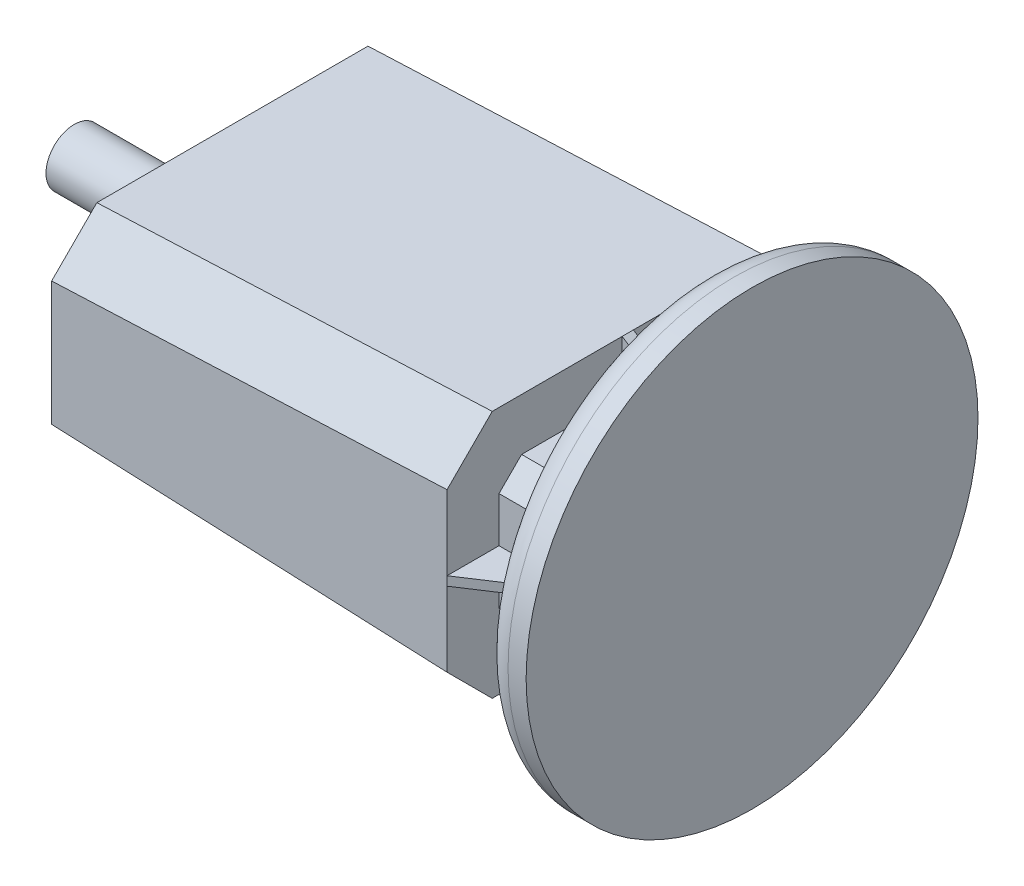
ISO-10303-21;
HEADER;
FILE_DESCRIPTION(('STEP AP214'),'2;1');
FILE_NAME('part.step','',(''),(''),'','','');
FILE_SCHEMA(('AUTOMOTIVE_DESIGN { 1 0 10303 214 1 1 1 1 }'));
ENDSEC;
DATA;
#1=APPLICATION_CONTEXT('core data for automotive mechanical design processes');
#2=APPLICATION_PROTOCOL_DEFINITION('international standard','automotive_design',2000,#1);
#3=PRODUCT_CONTEXT('',#1,'mechanical');
#4=PRODUCT('Part','Part','',(#3));
#5=PRODUCT_RELATED_PRODUCT_CATEGORY('part','',(#4));
#6=PRODUCT_DEFINITION_FORMATION('','',#4);
#7=PRODUCT_DEFINITION_CONTEXT('part definition',#1,'design');
#8=PRODUCT_DEFINITION('design','',#6,#7);
#9=PRODUCT_DEFINITION_SHAPE('','',#8);
#10=(LENGTH_UNIT() NAMED_UNIT(*) SI_UNIT(.MILLI.,.METRE.));
#11=(NAMED_UNIT(*) PLANE_ANGLE_UNIT() SI_UNIT($,.RADIAN.));
#12=(NAMED_UNIT(*) SI_UNIT($,.STERADIAN.) SOLID_ANGLE_UNIT());
#13=UNCERTAINTY_MEASURE_WITH_UNIT(LENGTH_MEASURE(1.E-05),#10,'distance_accuracy_value','');
#14=(GEOMETRIC_REPRESENTATION_CONTEXT(3) GLOBAL_UNCERTAINTY_ASSIGNED_CONTEXT((#13)) GLOBAL_UNIT_ASSIGNED_CONTEXT((#10,
#11,#12)) REPRESENTATION_CONTEXT('',''));
#15=CARTESIAN_POINT('',(0.,0.,0.));
#16=DIRECTION('',(0.,0.,1.));
#17=DIRECTION('',(1.,0.,0.));
#18=AXIS2_PLACEMENT_3D('',#15,#16,#17);
#19=CARTESIAN_POINT('',(175.,55.,160.));
#20=DIRECTION('',(-1.,0.,0.));
#21=DIRECTION('',(0.,0.,1.));
#22=AXIS2_PLACEMENT_3D('',#19,#20,#21);
#23=PLANE('',#22);
#24=DIRECTION('',(0.,0.,1.));
#25=VECTOR('',#24,1.);
#26=CARTESIAN_POINT('',(175.,1.99999999999999,0.));
#27=LINE('',#26,#25);
#28=CARTESIAN_POINT('',(175.,1.99999999999999,0.));
#29=VERTEX_POINT('',#28);
#30=CARTESIAN_POINT('',(175.,1.99999999999999,23.));
#31=VERTEX_POINT('',#30);
#32=EDGE_CURVE('E1006',#29,#31,#27,.T.);
#33=ORIENTED_EDGE('',*,*,#32,.F.);
#34=DIRECTION('',(0.,1.,0.));
#35=VECTOR('',#34,1.);
#36=CARTESIAN_POINT('',(175.,55.,0.));
#37=LINE('',#36,#35);
#38=CARTESIAN_POINT('',(175.,34.9816410793103,0.));
#39=VERTEX_POINT('',#38);
#40=EDGE_CURVE('E323',#29,#39,#37,.T.);
#41=ORIENTED_EDGE('',*,*,#40,.T.);
#42=DIRECTION('',(0.,0.707431100787277,0.706782312766032));
#43=VECTOR('',#42,1.);
#44=CARTESIAN_POINT('',(175.,51.2465592822918,16.2500015784722));
#45=LINE('',#44,#43);
#46=CARTESIAN_POINT('',(175.,55.,20.));
#47=VERTEX_POINT('',#46);
#48=EDGE_CURVE('E347',#39,#47,#45,.T.);
#49=ORIENTED_EDGE('',*,*,#48,.T.);
#50=DIRECTION('',(0.,0.,-1.));
#51=VECTOR('',#50,1.);
#52=CARTESIAN_POINT('',(175.,55.,160.));
#53=LINE('',#52,#51);
#54=CARTESIAN_POINT('',(175.,55.,77.5));
#55=VERTEX_POINT('',#54);
#56=EDGE_CURVE('E320',#55,#47,#53,.T.);
#57=ORIENTED_EDGE('',*,*,#56,.F.);
#58=DIRECTION('',(0.,-1.,0.));
#59=VECTOR('',#58,1.);
#60=CARTESIAN_POINT('',(175.,32.,77.5));
#61=LINE('',#60,#59);
#62=CARTESIAN_POINT('',(175.,32.,77.5));
#63=VERTEX_POINT('',#62);
#64=EDGE_CURVE('E484',#55,#63,#61,.T.);
#65=ORIENTED_EDGE('',*,*,#64,.T.);
#66=DIRECTION('',(0.,0.,1.));
#67=VECTOR('',#66,1.);
#68=CARTESIAN_POINT('',(175.,32.,127.));
#69=LINE('',#68,#67);
#70=CARTESIAN_POINT('',(175.,32.,33.));
#71=VERTEX_POINT('',#70);
#72=EDGE_CURVE('E275',#71,#63,#69,.T.);
#73=ORIENTED_EDGE('',*,*,#72,.F.);
#74=DIRECTION('',(0.,0.707106781186548,0.707106781186548));
#75=VECTOR('',#74,1.);
#76=CARTESIAN_POINT('',(175.,32.,33.));
#77=LINE('',#76,#75);
#78=CARTESIAN_POINT('',(175.,22.,23.));
#79=VERTEX_POINT('',#78);
#80=EDGE_CURVE('E271',#79,#71,#77,.T.);
#81=ORIENTED_EDGE('',*,*,#80,.F.);
#82=DIRECTION('',(0.,1.,0.));
#83=VECTOR('',#82,1.);
#84=CARTESIAN_POINT('',(175.,22.,23.));
#85=LINE('',#84,#83);
#86=EDGE_CURVE('E266',#31,#79,#85,.T.);
#87=ORIENTED_EDGE('',*,*,#86,.F.);
#88=EDGE_LOOP('',(#33,#41,#49,#57,#65,#73,#81,#87));
#89=FACE_BOUND('',#88,.T.);
#90=ADVANCED_FACE('F43',(#89),#23,.F.);
#91=CARTESIAN_POINT('',(210.,22.,23.));
#92=DIRECTION('',(0.,0.,1.));
#93=DIRECTION('',(0.,-1.,0.));
#94=AXIS2_PLACEMENT_3D('',#91,#92,#93);
#95=PLANE('',#94);
#96=DIRECTION('',(1.,0.,0.));
#97=VECTOR('',#96,1.);
#98=CARTESIAN_POINT('',(210.,1.99999999999999,23.));
#99=LINE('',#98,#97);
#100=CARTESIAN_POINT('',(210.,1.99999999999999,23.));
#101=VERTEX_POINT('',#100);
#102=EDGE_CURVE('E1008',#31,#101,#99,.T.);
#103=ORIENTED_EDGE('',*,*,#102,.F.);
#104=ORIENTED_EDGE('',*,*,#86,.T.);
#105=DIRECTION('',(-1.,0.,0.));
#106=VECTOR('',#105,1.);
#107=CARTESIAN_POINT('',(210.,22.,23.));
#108=LINE('',#107,#106);
#109=CARTESIAN_POINT('',(210.,22.,23.));
#110=VERTEX_POINT('',#109);
#111=EDGE_CURVE('E304',#110,#79,#108,.T.);
#112=ORIENTED_EDGE('',*,*,#111,.F.);
#113=DIRECTION('',(0.,1.,0.));
#114=VECTOR('',#113,1.);
#115=CARTESIAN_POINT('',(210.,22.,23.));
#116=LINE('',#115,#114);
#117=EDGE_CURVE('E239',#101,#110,#116,.T.);
#118=ORIENTED_EDGE('',*,*,#117,.F.);
#119=EDGE_LOOP('',(#103,#104,#112,#118));
#120=FACE_BOUND('',#119,.T.);
#121=ADVANCED_FACE('F396',(#120),#95,.F.);
#122=DIRECTION('',(0.,0.,-1.));
#123=VECTOR('',#122,1.);
#124=CARTESIAN_POINT('',(175.,-1.99999999999999,160.));
#125=LINE('',#124,#123);
#126=CARTESIAN_POINT('',(175.,-1.99999999999999,160.));
#127=VERTEX_POINT('',#126);
#128=CARTESIAN_POINT('',(175.,-1.99999999999999,137.));
#129=VERTEX_POINT('',#128);
#130=EDGE_CURVE('E1025',#127,#129,#125,.T.);
#131=ORIENTED_EDGE('',*,*,#130,.F.);
#132=DIRECTION('',(0.,1.,0.));
#133=VECTOR('',#132,1.);
#134=CARTESIAN_POINT('',(175.,55.,160.));
#135=LINE('',#134,#133);
#136=CARTESIAN_POINT('',(175.,-34.9816410793105,160.));
#137=VERTEX_POINT('',#136);
#138=EDGE_CURVE('E317',#137,#127,#135,.T.);
#139=ORIENTED_EDGE('',*,*,#138,.F.);
#140=DIRECTION('',(0.,0.707431100787275,0.706782312766034));
#141=VECTOR('',#140,1.);
#142=CARTESIAN_POINT('',(175.,-31.2029852765055,163.775190381765));
#143=LINE('',#142,#141);
#144=CARTESIAN_POINT('',(175.,-55.,140.));
#145=VERTEX_POINT('',#144);
#146=EDGE_CURVE('E353',#137,#145,#143,.F.);
#147=ORIENTED_EDGE('',*,*,#146,.T.);
#148=DIRECTION('',(0.,0.,-1.));
#149=VECTOR('',#148,1.);
#150=CARTESIAN_POINT('',(175.,-55.,160.));
#151=LINE('',#150,#149);
#152=CARTESIAN_POINT('',(175.,-55.,82.5));
#153=VERTEX_POINT('',#152);
#154=EDGE_CURVE('E330',#145,#153,#151,.T.);
#155=ORIENTED_EDGE('',*,*,#154,.T.);
#156=DIRECTION('',(0.,1.,0.));
#157=VECTOR('',#156,1.);
#158=CARTESIAN_POINT('',(175.,-32.,82.5));
#159=LINE('',#158,#157);
#160=CARTESIAN_POINT('',(175.,-32.,82.5));
#161=VERTEX_POINT('',#160);
#162=EDGE_CURVE('E464',#153,#161,#159,.T.);
#163=ORIENTED_EDGE('',*,*,#162,.T.);
#164=DIRECTION('',(0.,0.,-1.));
#165=VECTOR('',#164,1.);
#166=CARTESIAN_POINT('',(175.,-32.,127.));
#167=LINE('',#166,#165);
#168=CARTESIAN_POINT('',(175.,-32.,127.));
#169=VERTEX_POINT('',#168);
#170=EDGE_CURVE('E240',#169,#161,#167,.T.);
#171=ORIENTED_EDGE('',*,*,#170,.F.);
#172=DIRECTION('',(0.,-0.707106781186546,-0.707106781186549));
#173=VECTOR('',#172,1.);
#174=CARTESIAN_POINT('',(175.,-22.,137.));
#175=LINE('',#174,#173);
#176=CARTESIAN_POINT('',(175.,-22.,137.));
#177=VERTEX_POINT('',#176);
#178=EDGE_CURVE('E285',#177,#169,#175,.T.);
#179=ORIENTED_EDGE('',*,*,#178,.F.);
#180=DIRECTION('',(0.,-1.,0.));
#181=VECTOR('',#180,1.);
#182=CARTESIAN_POINT('',(175.,22.,137.));
#183=LINE('',#182,#181);
#184=EDGE_CURVE('E281',#129,#177,#183,.T.);
#185=ORIENTED_EDGE('',*,*,#184,.F.);
#186=EDGE_LOOP('',(#131,#139,#147,#155,#163,#171,#179,#185));
#187=FACE_BOUND('',#186,.T.);
#188=ADVANCED_FACE('F399',(#187),#23,.F.);
#189=CARTESIAN_POINT('',(210.,22.,137.));
#190=DIRECTION('',(0.,0.,-1.));
#191=DIRECTION('',(-1.,0.,0.));
#192=AXIS2_PLACEMENT_3D('',#189,#190,#191);
#193=PLANE('',#192);
#194=DIRECTION('',(1.,0.,0.));
#195=VECTOR('',#194,1.);
#196=CARTESIAN_POINT('',(210.,-1.99999999999999,137.));
#197=LINE('',#196,#195);
#198=CARTESIAN_POINT('',(210.,-1.99999999999999,137.));
#199=VERTEX_POINT('',#198);
#200=EDGE_CURVE('E515',#129,#199,#197,.T.);
#201=ORIENTED_EDGE('',*,*,#200,.F.);
#202=ORIENTED_EDGE('',*,*,#184,.T.);
#203=DIRECTION('',(-1.,0.,0.));
#204=VECTOR('',#203,1.);
#205=CARTESIAN_POINT('',(210.,-22.,137.));
#206=LINE('',#205,#204);
#207=CARTESIAN_POINT('',(210.,-22.,137.));
#208=VERTEX_POINT('',#207);
#209=EDGE_CURVE('E292',#208,#177,#206,.T.);
#210=ORIENTED_EDGE('',*,*,#209,.F.);
#211=DIRECTION('',(0.,-1.,0.));
#212=VECTOR('',#211,1.);
#213=CARTESIAN_POINT('',(210.,22.,137.));
#214=LINE('',#213,#212);
#215=EDGE_CURVE('E508',#199,#208,#214,.T.);
#216=ORIENTED_EDGE('',*,*,#215,.F.);
#217=EDGE_LOOP('',(#201,#202,#210,#216));
#218=FACE_BOUND('',#217,.T.);
#219=ADVANCED_FACE('F411',(#218),#193,.F.);
#220=CARTESIAN_POINT('',(175.,2.00000000000001,160.));
#221=VERTEX_POINT('',#220);
#222=CARTESIAN_POINT('',(175.,34.9816410793105,160.));
#223=VERTEX_POINT('',#222);
#224=EDGE_CURVE('E315',#221,#223,#135,.T.);
#225=ORIENTED_EDGE('',*,*,#224,.F.);
#226=DIRECTION('',(0.,0.,-1.));
#227=VECTOR('',#226,1.);
#228=CARTESIAN_POINT('',(175.,2.00000000000001,160.));
#229=LINE('',#228,#227);
#230=CARTESIAN_POINT('',(175.,2.00000000000001,137.));
#231=VERTEX_POINT('',#230);
#232=EDGE_CURVE('E439',#221,#231,#229,.T.);
#233=ORIENTED_EDGE('',*,*,#232,.T.);
#234=CARTESIAN_POINT('',(175.,22.,137.));
#235=VERTEX_POINT('',#234);
#236=EDGE_CURVE('E282',#235,#231,#183,.T.);
#237=ORIENTED_EDGE('',*,*,#236,.F.);
#238=DIRECTION('',(0.,-0.707106781186547,0.707106781186548));
#239=VECTOR('',#238,1.);
#240=CARTESIAN_POINT('',(175.,22.,137.));
#241=LINE('',#240,#239);
#242=CARTESIAN_POINT('',(175.,32.,127.));
#243=VERTEX_POINT('',#242);
#244=EDGE_CURVE('E278',#243,#235,#241,.T.);
#245=ORIENTED_EDGE('',*,*,#244,.F.);
#246=CARTESIAN_POINT('',(175.,32.,82.5));
#247=VERTEX_POINT('',#246);
#248=EDGE_CURVE('E274',#247,#243,#69,.T.);
#249=ORIENTED_EDGE('',*,*,#248,.F.);
#250=DIRECTION('',(0.,-1.,0.));
#251=VECTOR('',#250,1.);
#252=CARTESIAN_POINT('',(175.,32.,82.5));
#253=LINE('',#252,#251);
#254=CARTESIAN_POINT('',(175.,55.,82.5));
#255=VERTEX_POINT('',#254);
#256=EDGE_CURVE('E475',#255,#247,#253,.T.);
#257=ORIENTED_EDGE('',*,*,#256,.F.);
#258=CARTESIAN_POINT('',(175.,55.,140.));
#259=VERTEX_POINT('',#258);
#260=EDGE_CURVE('E326',#259,#255,#53,.T.);
#261=ORIENTED_EDGE('',*,*,#260,.F.);
#262=DIRECTION('',(0.,0.707431100787275,-0.706782312766034));
#263=VECTOR('',#262,1.);
#264=CARTESIAN_POINT('',(175.,31.2029852765055,163.775190381765));
#265=LINE('',#264,#263);
#266=EDGE_CURVE('E350',#259,#223,#265,.F.);
#267=ORIENTED_EDGE('',*,*,#266,.T.);
#268=EDGE_LOOP('',(#225,#233,#237,#245,#249,#257,#261,#267));
#269=FACE_BOUND('',#268,.T.);
#270=ADVANCED_FACE('F413',(#269),#23,.F.);
#271=CARTESIAN_POINT('',(210.,-32.,127.));
#272=DIRECTION('',(0.,1.,0.));
#273=DIRECTION('',(0.,0.,1.));
#274=AXIS2_PLACEMENT_3D('',#271,#272,#273);
#275=PLANE('',#274);
#276=DIRECTION('',(1.,0.,0.));
#277=VECTOR('',#276,1.);
#278=CARTESIAN_POINT('',(210.,-32.,82.5));
#279=LINE('',#278,#277);
#280=CARTESIAN_POINT('',(210.,-32.,82.5));
#281=VERTEX_POINT('',#280);
#282=EDGE_CURVE('E467',#161,#281,#279,.T.);
#283=ORIENTED_EDGE('',*,*,#282,.T.);
#284=DIRECTION('',(0.,0.,-1.));
#285=VECTOR('',#284,1.);
#286=CARTESIAN_POINT('',(210.,-32.,127.));
#287=LINE('',#286,#285);
#288=CARTESIAN_POINT('',(210.,-32.,127.));
#289=VERTEX_POINT('',#288);
#290=EDGE_CURVE('E252',#289,#281,#287,.T.);
#291=ORIENTED_EDGE('',*,*,#290,.F.);
#292=DIRECTION('',(-1.,0.,0.));
#293=VECTOR('',#292,1.);
#294=CARTESIAN_POINT('',(210.,-32.,127.));
#295=LINE('',#294,#293);
#296=EDGE_CURVE('E251',#289,#169,#295,.T.);
#297=ORIENTED_EDGE('',*,*,#296,.T.);
#298=ORIENTED_EDGE('',*,*,#170,.T.);
#299=EDGE_LOOP('',(#283,#291,#297,#298));
#300=FACE_BOUND('',#299,.T.);
#301=ADVANCED_FACE('F416',(#300),#275,.F.);
#302=CARTESIAN_POINT('',(175.,-34.9816410793103,0.));
#303=VERTEX_POINT('',#302);
#304=CARTESIAN_POINT('',(175.,-2.00000000000001,0.));
#305=VERTEX_POINT('',#304);
#306=EDGE_CURVE('E316',#303,#305,#37,.T.);
#307=ORIENTED_EDGE('',*,*,#306,.T.);
#308=DIRECTION('',(0.,0.,1.));
#309=VECTOR('',#308,1.);
#310=CARTESIAN_POINT('',(175.,-2.00000000000001,0.));
#311=LINE('',#310,#309);
#312=CARTESIAN_POINT('',(175.,-2.00000000000001,23.));
#313=VERTEX_POINT('',#312);
#314=EDGE_CURVE('E1045',#305,#313,#311,.T.);
#315=ORIENTED_EDGE('',*,*,#314,.T.);
#316=CARTESIAN_POINT('',(175.,-22.,23.));
#317=VERTEX_POINT('',#316);
#318=EDGE_CURVE('E268',#317,#313,#85,.T.);
#319=ORIENTED_EDGE('',*,*,#318,.F.);
#320=DIRECTION('',(0.,0.707106781186547,-0.707106781186548));
#321=VECTOR('',#320,1.);
#322=CARTESIAN_POINT('',(175.,-32.,33.));
#323=LINE('',#322,#321);
#324=CARTESIAN_POINT('',(175.,-32.,33.));
#325=VERTEX_POINT('',#324);
#326=EDGE_CURVE('E264',#325,#317,#323,.T.);
#327=ORIENTED_EDGE('',*,*,#326,.F.);
#328=CARTESIAN_POINT('',(175.,-32.,77.5));
#329=VERTEX_POINT('',#328);
#330=EDGE_CURVE('E249',#329,#325,#167,.T.);
#331=ORIENTED_EDGE('',*,*,#330,.F.);
#332=DIRECTION('',(0.,1.,0.));
#333=VECTOR('',#332,1.);
#334=CARTESIAN_POINT('',(175.,-32.,77.5));
#335=LINE('',#334,#333);
#336=CARTESIAN_POINT('',(175.,-55.,77.5));
#337=VERTEX_POINT('',#336);
#338=EDGE_CURVE('E448',#337,#329,#335,.T.);
#339=ORIENTED_EDGE('',*,*,#338,.F.);
#340=CARTESIAN_POINT('',(175.,-55.,20.));
#341=VERTEX_POINT('',#340);
#342=EDGE_CURVE('E329',#337,#341,#151,.T.);
#343=ORIENTED_EDGE('',*,*,#342,.T.);
#344=DIRECTION('',(0.,0.707431100787277,-0.706782312766032));
#345=VECTOR('',#344,1.);
#346=CARTESIAN_POINT('',(175.,-51.2465592822918,16.2500015784722));
#347=LINE('',#346,#345);
#348=EDGE_CURVE('E355',#341,#303,#347,.T.);
#349=ORIENTED_EDGE('',*,*,#348,.T.);
#350=EDGE_LOOP('',(#307,#315,#319,#327,#331,#339,#343,#349));
#351=FACE_BOUND('',#350,.T.);
#352=ADVANCED_FACE('F400',(#351),#23,.F.);
#353=CARTESIAN_POINT('',(210.,32.,127.));
#354=DIRECTION('',(0.,-1.,0.));
#355=DIRECTION('',(0.,0.,-1.));
#356=AXIS2_PLACEMENT_3D('',#353,#354,#355);
#357=PLANE('',#356);
#358=DIRECTION('',(1.,0.,0.));
#359=VECTOR('',#358,1.);
#360=CARTESIAN_POINT('',(210.,32.,77.5));
#361=LINE('',#360,#359);
#362=CARTESIAN_POINT('',(210.,32.,77.5));
#363=VERTEX_POINT('',#362);
#364=EDGE_CURVE('E487',#63,#363,#361,.T.);
#365=ORIENTED_EDGE('',*,*,#364,.T.);
#366=DIRECTION('',(0.,0.,1.));
#367=VECTOR('',#366,1.);
#368=CARTESIAN_POINT('',(210.,32.,127.));
#369=LINE('',#368,#367);
#370=CARTESIAN_POINT('',(210.,32.,33.));
#371=VERTEX_POINT('',#370);
#372=EDGE_CURVE('E503',#371,#363,#369,.T.);
#373=ORIENTED_EDGE('',*,*,#372,.F.);
#374=DIRECTION('',(-1.,0.,0.));
#375=VECTOR('',#374,1.);
#376=CARTESIAN_POINT('',(210.,32.,33.));
#377=LINE('',#376,#375);
#378=EDGE_CURVE('E301',#371,#71,#377,.T.);
#379=ORIENTED_EDGE('',*,*,#378,.T.);
#380=ORIENTED_EDGE('',*,*,#72,.T.);
#381=EDGE_LOOP('',(#365,#373,#379,#380));
#382=FACE_BOUND('',#381,.T.);
#383=ADVANCED_FACE('F415',(#382),#357,.F.);
#384=CARTESIAN_POINT('',(0.,47.5,160.));
#385=DIRECTION('',(0.0428178383921858,-0.99908289581767,0.));
#386=DIRECTION('',(0.99908289581767,0.0428178383921859,0.));
#387=AXIS2_PLACEMENT_3D('',#384,#385,#386);
#388=PLANE('',#387);
#389=DIRECTION('',(0.,0.,-1.));
#390=VECTOR('',#389,1.);
#391=CARTESIAN_POINT('',(0.,47.5,160.));
#392=LINE('',#391,#390);
#393=CARTESIAN_POINT('',(0.,47.5,140.));
#394=VERTEX_POINT('',#393);
#395=CARTESIAN_POINT('',(0.,47.5,20.));
#396=VERTEX_POINT('',#395);
#397=EDGE_CURVE('E336',#394,#396,#392,.T.);
#398=ORIENTED_EDGE('',*,*,#397,.F.);
#399=DIRECTION('',(0.99908289581767,0.0428178383921859,0.));
#400=VECTOR('',#399,1.);
#401=CARTESIAN_POINT('',(0.,47.5,140.));
#402=LINE('',#401,#400);
#403=EDGE_CURVE('E379',#394,#259,#402,.T.);
#404=ORIENTED_EDGE('',*,*,#403,.T.);
#405=ORIENTED_EDGE('',*,*,#260,.T.);
#406=DIRECTION('',(0.,0.,1.));
#407=VECTOR('',#406,1.);
#408=CARTESIAN_POINT('',(175.,55.,77.5));
#409=LINE('',#408,#407);
#410=EDGE_CURVE('E267',#55,#255,#409,.T.);
#411=ORIENTED_EDGE('',*,*,#410,.F.);
#412=ORIENTED_EDGE('',*,*,#56,.T.);
#413=DIRECTION('',(-0.99908289581767,-0.0428178383921859,0.));
#414=VECTOR('',#413,1.);
#415=CARTESIAN_POINT('',(0.,47.5,20.));
#416=LINE('',#415,#414);
#417=EDGE_CURVE('E376',#47,#396,#416,.T.);
#418=ORIENTED_EDGE('',*,*,#417,.T.);
#419=EDGE_LOOP('',(#398,#404,#405,#411,#412,#418));
#420=FACE_BOUND('',#419,.T.);
#421=ADVANCED_FACE('F422',(#420),#388,.F.);
#422=CARTESIAN_POINT('',(0.,-47.5,160.));
#423=DIRECTION('',(1.,0.,0.));
#424=DIRECTION('',(0.,0.,-1.));
#425=AXIS2_PLACEMENT_3D('',#422,#423,#424);
#426=PLANE('',#425);
#427=CARTESIAN_POINT('',(0.,0.,80.));
#428=DIRECTION('',(1.,0.,0.));
#429=DIRECTION('',(0.,0.,-1.));
#430=AXIS2_PLACEMENT_3D('',#427,#428,#429);
#431=CIRCLE('',#430,12.5);
#432=CARTESIAN_POINT('',(0.,0.,67.5));
#433=VERTEX_POINT('',#432);
#434=EDGE_CURVE('E339',#433,#433,#431,.F.);
#435=ORIENTED_EDGE('',*,*,#434,.F.);
#436=EDGE_LOOP('',(#435));
#437=FACE_BOUND('',#436,.T.);
#438=DIRECTION('',(0.,-1.,0.));
#439=VECTOR('',#438,1.);
#440=CARTESIAN_POINT('',(0.,-47.5,0.));
#441=LINE('',#440,#439);
#442=CARTESIAN_POINT('',(0.,27.4816410793103,0.));
#443=VERTEX_POINT('',#442);
#444=CARTESIAN_POINT('',(0.,-27.4816410793103,0.));
#445=VERTEX_POINT('',#444);
#446=EDGE_CURVE('E311',#443,#445,#441,.T.);
#447=ORIENTED_EDGE('',*,*,#446,.T.);
#448=DIRECTION('',(0.,-0.707431100787277,0.706782312766032));
#449=VECTOR('',#448,1.);
#450=CARTESIAN_POINT('',(0.,-47.5,20.));
#451=LINE('',#450,#449);
#452=CARTESIAN_POINT('',(0.,-47.5,20.));
#453=VERTEX_POINT('',#452);
#454=EDGE_CURVE('E368',#445,#453,#451,.T.);
#455=ORIENTED_EDGE('',*,*,#454,.T.);
#456=DIRECTION('',(0.,0.,-1.));
#457=VECTOR('',#456,1.);
#458=CARTESIAN_POINT('',(0.,-47.5,160.));
#459=LINE('',#458,#457);
#460=CARTESIAN_POINT('',(0.,-47.5,140.));
#461=VERTEX_POINT('',#460);
#462=EDGE_CURVE('E333',#461,#453,#459,.T.);
#463=ORIENTED_EDGE('',*,*,#462,.F.);
#464=DIRECTION('',(0.,-0.707431100787275,-0.706782312766034));
#465=VECTOR('',#464,1.);
#466=CARTESIAN_POINT('',(0.,-27.4564259942137,160.025191960237));
#467=LINE('',#466,#465);
#468=CARTESIAN_POINT('',(0.,-27.4816410793105,160.));
#469=VERTEX_POINT('',#468);
#470=EDGE_CURVE('E366',#461,#469,#467,.F.);
#471=ORIENTED_EDGE('',*,*,#470,.T.);
#472=DIRECTION('',(0.,-1.,0.));
#473=VECTOR('',#472,1.);
#474=CARTESIAN_POINT('',(0.,-47.5,160.));
#475=LINE('',#474,#473);
#476=CARTESIAN_POINT('',(0.,27.4816410793105,160.));
#477=VERTEX_POINT('',#476);
#478=EDGE_CURVE('E312',#477,#469,#475,.T.);
#479=ORIENTED_EDGE('',*,*,#478,.F.);
#480=DIRECTION('',(0.,-0.707431100787275,0.706782312766034));
#481=VECTOR('',#480,1.);
#482=CARTESIAN_POINT('',(0.,27.4564259942137,160.025191960237));
#483=LINE('',#482,#481);
#484=EDGE_CURVE('E364',#477,#394,#483,.F.);
#485=ORIENTED_EDGE('',*,*,#484,.T.);
#486=ORIENTED_EDGE('',*,*,#397,.T.);
#487=DIRECTION('',(0.,-0.707431100787277,-0.706782312766032));
#488=VECTOR('',#487,1.);
#489=CARTESIAN_POINT('',(0.,47.5,20.));
#490=LINE('',#489,#488);
#491=EDGE_CURVE('E362',#396,#443,#490,.T.);
#492=ORIENTED_EDGE('',*,*,#491,.T.);
#493=EDGE_LOOP('',(#447,#455,#463,#471,#479,#485,#486,#492));
#494=FACE_BOUND('',#493,.T.);
#495=ADVANCED_FACE('F538',(#437,#494),#426,.F.);
#496=CARTESIAN_POINT('',(0.,-47.5,160.));
#497=DIRECTION('',(0.0428178383921858,0.99908289581767,0.));
#498=DIRECTION('',(-0.99908289581767,0.0428178383921859,0.));
#499=AXIS2_PLACEMENT_3D('',#496,#497,#498);
#500=PLANE('',#499);
#501=ORIENTED_EDGE('',*,*,#462,.T.);
#502=DIRECTION('',(0.99908289581767,-0.0428178383921859,0.));
#503=VECTOR('',#502,1.);
#504=CARTESIAN_POINT('',(175.,-55.,20.));
#505=LINE('',#504,#503);
#506=EDGE_CURVE('E344',#453,#341,#505,.T.);
#507=ORIENTED_EDGE('',*,*,#506,.T.);
#508=ORIENTED_EDGE('',*,*,#342,.F.);
#509=DIRECTION('',(0.,0.,-1.));
#510=VECTOR('',#509,1.);
#511=CARTESIAN_POINT('',(175.,-55.,82.5));
#512=LINE('',#511,#510);
#513=EDGE_CURVE('E473',#153,#337,#512,.T.);
#514=ORIENTED_EDGE('',*,*,#513,.F.);
#515=ORIENTED_EDGE('',*,*,#154,.F.);
#516=DIRECTION('',(-0.99908289581767,0.0428178383921859,0.));
#517=VECTOR('',#516,1.);
#518=CARTESIAN_POINT('',(0.,-47.5,140.));
#519=LINE('',#518,#517);
#520=EDGE_CURVE('E342',#145,#461,#519,.T.);
#521=ORIENTED_EDGE('',*,*,#520,.T.);
#522=EDGE_LOOP('',(#501,#507,#508,#514,#515,#521));
#523=FACE_BOUND('',#522,.T.);
#524=ADVANCED_FACE('F529',(#523),#500,.F.);
#525=CARTESIAN_POINT('',(0.,0.,160.));
#526=DIRECTION('',(0.,0.,-1.));
#527=DIRECTION('',(-1.,0.,0.));
#528=AXIS2_PLACEMENT_3D('',#525,#526,#527);
#529=PLANE('',#528);
#530=ORIENTED_EDGE('',*,*,#478,.T.);
#531=DIRECTION('',(0.99908289581767,-0.0428178383921859,0.));
#532=VECTOR('',#531,1.);
#533=CARTESIAN_POINT('',(-1.17562530589839,-27.4312571376291,160.));
#534=LINE('',#533,#532);
#535=EDGE_CURVE('E373',#469,#137,#534,.T.);
#536=ORIENTED_EDGE('',*,*,#535,.T.);
#537=ORIENTED_EDGE('',*,*,#138,.T.);
#538=DIRECTION('',(0.,-1.,0.));
#539=VECTOR('',#538,1.);
#540=CARTESIAN_POINT('',(175.,2.00000000000001,160.));
#541=LINE('',#540,#539);
#542=EDGE_CURVE('E444',#221,#127,#541,.T.);
#543=ORIENTED_EDGE('',*,*,#542,.F.);
#544=ORIENTED_EDGE('',*,*,#224,.T.);
#545=DIRECTION('',(-0.99908289581767,-0.0428178383921859,0.));
#546=VECTOR('',#545,1.);
#547=CARTESIAN_POINT('',(-1.17562530589839,27.4312571376291,160.));
#548=LINE('',#547,#546);
#549=EDGE_CURVE('E370',#223,#477,#548,.T.);
#550=ORIENTED_EDGE('',*,*,#549,.T.);
#551=EDGE_LOOP('',(#530,#536,#537,#543,#544,#550));
#552=FACE_BOUND('',#551,.T.);
#553=ADVANCED_FACE('F445',(#552),#529,.F.);
#554=CARTESIAN_POINT('',(0.,0.,0.));
#555=DIRECTION('',(0.,0.,-1.));
#556=DIRECTION('',(-1.,0.,0.));
#557=AXIS2_PLACEMENT_3D('',#554,#555,#556);
#558=PLANE('',#557);
#559=ORIENTED_EDGE('',*,*,#306,.F.);
#560=DIRECTION('',(-0.99908289581767,0.0428178383921859,0.));
#561=VECTOR('',#560,1.);
#562=CARTESIAN_POINT('',(0.856356767843722,-27.5183420836465,0.));
#563=LINE('',#562,#561);
#564=EDGE_CURVE('E360',#303,#445,#563,.T.);
#565=ORIENTED_EDGE('',*,*,#564,.T.);
#566=ORIENTED_EDGE('',*,*,#446,.F.);
#567=DIRECTION('',(0.99908289581767,0.0428178383921859,0.));
#568=VECTOR('',#567,1.);
#569=CARTESIAN_POINT('',(175.856356767844,35.0183420836465,0.));
#570=LINE('',#569,#568);
#571=EDGE_CURVE('E357',#443,#39,#570,.T.);
#572=ORIENTED_EDGE('',*,*,#571,.T.);
#573=ORIENTED_EDGE('',*,*,#40,.F.);
#574=DIRECTION('',(0.,1.,0.));
#575=VECTOR('',#574,1.);
#576=CARTESIAN_POINT('',(175.,-2.00000000000001,0.));
#577=LINE('',#576,#575);
#578=EDGE_CURVE('E1022',#305,#29,#577,.T.);
#579=ORIENTED_EDGE('',*,*,#578,.F.);
#580=EDGE_LOOP('',(#559,#565,#566,#572,#573,#579));
#581=FACE_BOUND('',#580,.T.);
#582=ADVANCED_FACE('F555',(#581),#558,.T.);
#583=CARTESIAN_POINT('',(-70.,0.,80.));
#584=DIRECTION('',(1.,0.,0.));
#585=DIRECTION('',(0.,0.,-1.));
#586=AXIS2_PLACEMENT_3D('',#583,#584,#585);
#587=CYLINDRICAL_SURFACE('',#586,12.5);
#588=CARTESIAN_POINT('',(-70.,0.,80.));
#589=DIRECTION('',(-1.,0.,0.));
#590=DIRECTION('',(0.,0.,1.));
#591=AXIS2_PLACEMENT_3D('',#588,#589,#590);
#592=CIRCLE('',#591,12.5);
#593=CARTESIAN_POINT('',(-70.,0.,92.5));
#594=VERTEX_POINT('',#593);
#595=EDGE_CURVE('E308',#594,#594,#592,.T.);
#596=ORIENTED_EDGE('',*,*,#595,.F.);
#597=EDGE_LOOP('',(#596));
#598=FACE_BOUND('',#597,.T.);
#599=ORIENTED_EDGE('',*,*,#434,.T.);
#600=EDGE_LOOP('',(#599));
#601=FACE_BOUND('',#600,.T.);
#602=ADVANCED_FACE('F610',(#598,#601),#587,.T.);
#603=CARTESIAN_POINT('',(-70.,0.,80.));
#604=DIRECTION('',(-1.,0.,0.));
#605=DIRECTION('',(0.,0.,1.));
#606=AXIS2_PLACEMENT_3D('',#603,#604,#605);
#607=PLANE('',#606);
#608=ORIENTED_EDGE('',*,*,#595,.T.);
#609=EDGE_LOOP('',(#608));
#610=FACE_BOUND('',#609,.T.);
#611=ADVANCED_FACE('F607',(#610),#607,.T.);
#612=CARTESIAN_POINT('',(0.,-47.5,20.));
#613=DIRECTION('',(-0.0302767838828643,-0.706458290600166,-0.707106781186549));
#614=DIRECTION('',(-0.99908289581767,0.0428178383921859,0.));
#615=AXIS2_PLACEMENT_3D('',#612,#613,#614);
#616=PLANE('',#615);
#617=ORIENTED_EDGE('',*,*,#454,.F.);
#618=ORIENTED_EDGE('',*,*,#564,.F.);
#619=ORIENTED_EDGE('',*,*,#348,.F.);
#620=ORIENTED_EDGE('',*,*,#506,.F.);
#621=EDGE_LOOP('',(#617,#618,#619,#620));
#622=FACE_BOUND('',#621,.T.);
#623=ADVANCED_FACE('F561',(#622),#616,.T.);
#624=CARTESIAN_POINT('',(-1.17562530589839,-27.4312571376291,160.));
#625=DIRECTION('',(0.0302767838828643,0.706458290600168,-0.707106781186547));
#626=DIRECTION('',(0.99908289581767,-0.0428178383921859,0.));
#627=AXIS2_PLACEMENT_3D('',#624,#625,#626);
#628=PLANE('',#627);
#629=ORIENTED_EDGE('',*,*,#470,.F.);
#630=ORIENTED_EDGE('',*,*,#520,.F.);
#631=ORIENTED_EDGE('',*,*,#146,.F.);
#632=ORIENTED_EDGE('',*,*,#535,.F.);
#633=EDGE_LOOP('',(#629,#630,#631,#632));
#634=FACE_BOUND('',#633,.T.);
#635=ADVANCED_FACE('F534',(#634),#628,.F.);
#636=CARTESIAN_POINT('',(-1.17562530589839,27.4312571376291,160.));
#637=DIRECTION('',(0.0302767838828643,-0.706458290600168,-0.707106781186547));
#638=DIRECTION('',(-0.99908289581767,-0.0428178383921859,0.));
#639=AXIS2_PLACEMENT_3D('',#636,#637,#638);
#640=PLANE('',#639);
#641=ORIENTED_EDGE('',*,*,#266,.F.);
#642=ORIENTED_EDGE('',*,*,#403,.F.);
#643=ORIENTED_EDGE('',*,*,#484,.F.);
#644=ORIENTED_EDGE('',*,*,#549,.F.);
#645=EDGE_LOOP('',(#641,#642,#643,#644));
#646=FACE_BOUND('',#645,.T.);
#647=ADVANCED_FACE('F540',(#646),#640,.F.);
#648=CARTESIAN_POINT('',(0.,47.5,20.));
#649=DIRECTION('',(-0.0302767838828643,0.706458290600166,-0.707106781186549));
#650=DIRECTION('',(0.99908289581767,0.0428178383921859,0.));
#651=AXIS2_PLACEMENT_3D('',#648,#649,#650);
#652=PLANE('',#651);
#653=ORIENTED_EDGE('',*,*,#48,.F.);
#654=ORIENTED_EDGE('',*,*,#571,.F.);
#655=ORIENTED_EDGE('',*,*,#491,.F.);
#656=ORIENTED_EDGE('',*,*,#417,.F.);
#657=EDGE_LOOP('',(#653,#654,#655,#656));
#658=FACE_BOUND('',#657,.T.);
#659=ADVANCED_FACE('F549',(#658),#652,.T.);
#660=CARTESIAN_POINT('',(210.,-32.,33.));
#661=DIRECTION('',(0.,0.707106781186548,0.707106781186547));
#662=DIRECTION('',(0.,-0.707106781186547,0.707106781186548));
#663=AXIS2_PLACEMENT_3D('',#660,#661,#662);
#664=PLANE('',#663);
#665=ORIENTED_EDGE('',*,*,#326,.T.);
#666=DIRECTION('',(-1.,0.,0.));
#667=VECTOR('',#666,1.);
#668=CARTESIAN_POINT('',(210.,-22.,23.));
#669=LINE('',#668,#667);
#670=CARTESIAN_POINT('',(210.,-22.,23.));
#671=VERTEX_POINT('',#670);
#672=EDGE_CURVE('E235',#671,#317,#669,.T.);
#673=ORIENTED_EDGE('',*,*,#672,.F.);
#674=DIRECTION('',(0.,0.707106781186547,-0.707106781186548));
#675=VECTOR('',#674,1.);
#676=CARTESIAN_POINT('',(210.,-32.,33.));
#677=LINE('',#676,#675);
#678=CARTESIAN_POINT('',(210.,-32.,33.));
#679=VERTEX_POINT('',#678);
#680=EDGE_CURVE('E229',#679,#671,#677,.T.);
#681=ORIENTED_EDGE('',*,*,#680,.F.);
#682=DIRECTION('',(-1.,0.,0.));
#683=VECTOR('',#682,1.);
#684=CARTESIAN_POINT('',(210.,-32.,33.));
#685=LINE('',#684,#683);
#686=EDGE_CURVE('E233',#679,#325,#685,.T.);
#687=ORIENTED_EDGE('',*,*,#686,.T.);
#688=EDGE_LOOP('',(#665,#673,#681,#687));
#689=FACE_BOUND('',#688,.T.);
#690=ADVANCED_FACE('F232',(#689),#664,.F.);
#691=ORIENTED_EDGE('',*,*,#318,.T.);
#692=DIRECTION('',(1.,0.,0.));
#693=VECTOR('',#692,1.);
#694=CARTESIAN_POINT('',(210.,-2.00000000000001,23.));
#695=LINE('',#694,#693);
#696=CARTESIAN_POINT('',(210.,-2.00000000000001,23.));
#697=VERTEX_POINT('',#696);
#698=EDGE_CURVE('E1027',#313,#697,#695,.T.);
#699=ORIENTED_EDGE('',*,*,#698,.T.);
#700=EDGE_CURVE('E497',#671,#697,#116,.T.);
#701=ORIENTED_EDGE('',*,*,#700,.F.);
#702=ORIENTED_EDGE('',*,*,#672,.T.);
#703=EDGE_LOOP('',(#691,#699,#701,#702));
#704=FACE_BOUND('',#703,.T.);
#705=ADVANCED_FACE('F406',(#704),#95,.F.);
#706=CARTESIAN_POINT('',(210.,32.,33.));
#707=DIRECTION('',(0.,-0.707106781186548,0.707106781186548));
#708=DIRECTION('',(0.,-0.707106781186548,-0.707106781186548));
#709=AXIS2_PLACEMENT_3D('',#706,#707,#708);
#710=PLANE('',#709);
#711=ORIENTED_EDGE('',*,*,#80,.T.);
#712=ORIENTED_EDGE('',*,*,#378,.F.);
#713=DIRECTION('',(0.,0.707106781186548,0.707106781186548));
#714=VECTOR('',#713,1.);
#715=CARTESIAN_POINT('',(210.,32.,33.));
#716=LINE('',#715,#714);
#717=EDGE_CURVE('E499',#110,#371,#716,.T.);
#718=ORIENTED_EDGE('',*,*,#717,.F.);
#719=ORIENTED_EDGE('',*,*,#111,.T.);
#720=EDGE_LOOP('',(#711,#712,#718,#719));
#721=FACE_BOUND('',#720,.T.);
#722=ADVANCED_FACE('F598',(#721),#710,.F.);
#723=CARTESIAN_POINT('',(210.,32.,82.5));
#724=VERTEX_POINT('',#723);
#725=CARTESIAN_POINT('',(210.,32.,127.));
#726=VERTEX_POINT('',#725);
#727=EDGE_CURVE('E502',#724,#726,#369,.T.);
#728=ORIENTED_EDGE('',*,*,#727,.F.);
#729=DIRECTION('',(1.,0.,0.));
#730=VECTOR('',#729,1.);
#731=CARTESIAN_POINT('',(210.,32.,82.5));
#732=LINE('',#731,#730);
#733=EDGE_CURVE('E478',#247,#724,#732,.T.);
#734=ORIENTED_EDGE('',*,*,#733,.F.);
#735=ORIENTED_EDGE('',*,*,#248,.T.);
#736=DIRECTION('',(-1.,0.,0.));
#737=VECTOR('',#736,1.);
#738=CARTESIAN_POINT('',(210.,32.,127.));
#739=LINE('',#738,#737);
#740=EDGE_CURVE('E298',#726,#243,#739,.T.);
#741=ORIENTED_EDGE('',*,*,#740,.F.);
#742=EDGE_LOOP('',(#728,#734,#735,#741));
#743=FACE_BOUND('',#742,.T.);
#744=ADVANCED_FACE('F425',(#743),#357,.F.);
#745=CARTESIAN_POINT('',(210.,22.,137.));
#746=DIRECTION('',(0.,-0.707106781186548,-0.707106781186547));
#747=DIRECTION('',(0.,0.707106781186547,-0.707106781186548));
#748=AXIS2_PLACEMENT_3D('',#745,#746,#747);
#749=PLANE('',#748);
#750=ORIENTED_EDGE('',*,*,#244,.T.);
#751=DIRECTION('',(-1.,0.,0.));
#752=VECTOR('',#751,1.);
#753=CARTESIAN_POINT('',(210.,22.,137.));
#754=LINE('',#753,#752);
#755=CARTESIAN_POINT('',(210.,22.,137.));
#756=VERTEX_POINT('',#755);
#757=EDGE_CURVE('E295',#756,#235,#754,.T.);
#758=ORIENTED_EDGE('',*,*,#757,.F.);
#759=DIRECTION('',(0.,-0.707106781186547,0.707106781186548));
#760=VECTOR('',#759,1.);
#761=CARTESIAN_POINT('',(210.,22.,137.));
#762=LINE('',#761,#760);
#763=EDGE_CURVE('E506',#726,#756,#762,.T.);
#764=ORIENTED_EDGE('',*,*,#763,.F.);
#765=ORIENTED_EDGE('',*,*,#740,.T.);
#766=EDGE_LOOP('',(#750,#758,#764,#765));
#767=FACE_BOUND('',#766,.T.);
#768=ADVANCED_FACE('F592',(#767),#749,.F.);
#769=ORIENTED_EDGE('',*,*,#236,.T.);
#770=DIRECTION('',(1.,0.,0.));
#771=VECTOR('',#770,1.);
#772=CARTESIAN_POINT('',(210.,2.00000000000001,137.));
#773=LINE('',#772,#771);
#774=CARTESIAN_POINT('',(210.,2.00000000000001,137.));
#775=VERTEX_POINT('',#774);
#776=EDGE_CURVE('E1033',#231,#775,#773,.T.);
#777=ORIENTED_EDGE('',*,*,#776,.T.);
#778=EDGE_CURVE('E260',#756,#775,#214,.T.);
#779=ORIENTED_EDGE('',*,*,#778,.F.);
#780=ORIENTED_EDGE('',*,*,#757,.T.);
#781=EDGE_LOOP('',(#769,#777,#779,#780));
#782=FACE_BOUND('',#781,.T.);
#783=ADVANCED_FACE('F435',(#782),#193,.F.);
#784=CARTESIAN_POINT('',(210.,-22.,137.));
#785=DIRECTION('',(0.,0.707106781186549,-0.707106781186546));
#786=DIRECTION('',(0.,0.707106781186546,0.707106781186549));
#787=AXIS2_PLACEMENT_3D('',#784,#785,#786);
#788=PLANE('',#787);
#789=ORIENTED_EDGE('',*,*,#178,.T.);
#790=ORIENTED_EDGE('',*,*,#296,.F.);
#791=DIRECTION('',(0.,-0.707106781186546,-0.707106781186549));
#792=VECTOR('',#791,1.);
#793=CARTESIAN_POINT('',(210.,-22.,137.));
#794=LINE('',#793,#792);
#795=EDGE_CURVE('E257',#208,#289,#794,.T.);
#796=ORIENTED_EDGE('',*,*,#795,.F.);
#797=ORIENTED_EDGE('',*,*,#209,.T.);
#798=EDGE_LOOP('',(#789,#790,#796,#797));
#799=FACE_BOUND('',#798,.T.);
#800=ADVANCED_FACE('F519',(#799),#788,.F.);
#801=CARTESIAN_POINT('',(210.,-32.,77.5));
#802=VERTEX_POINT('',#801);
#803=EDGE_CURVE('E246',#802,#679,#287,.T.);
#804=ORIENTED_EDGE('',*,*,#803,.F.);
#805=DIRECTION('',(1.,0.,0.));
#806=VECTOR('',#805,1.);
#807=CARTESIAN_POINT('',(210.,-32.,77.5));
#808=LINE('',#807,#806);
#809=EDGE_CURVE('E451',#329,#802,#808,.T.);
#810=ORIENTED_EDGE('',*,*,#809,.F.);
#811=ORIENTED_EDGE('',*,*,#330,.T.);
#812=ORIENTED_EDGE('',*,*,#686,.F.);
#813=EDGE_LOOP('',(#804,#810,#811,#812));
#814=FACE_BOUND('',#813,.T.);
#815=ADVANCED_FACE('F244',(#814),#275,.F.);
#816=CARTESIAN_POINT('',(175.,55.,77.5));
#817=DIRECTION('',(0.549177886660837,0.835705479701274,0.));
#818=DIRECTION('',(-0.835705479701274,0.549177886660837,0.));
#819=AXIS2_PLACEMENT_3D('',#816,#817,#818);
#820=PLANE('',#819);
#821=ORIENTED_EDGE('',*,*,#410,.T.);
#822=DIRECTION('',(-0.835705479701274,0.549177886660837,0.));
#823=VECTOR('',#822,1.);
#824=CARTESIAN_POINT('',(175.,55.,82.5));
#825=LINE('',#824,#823);
#826=EDGE_CURVE('E481',#724,#255,#825,.T.);
#827=ORIENTED_EDGE('',*,*,#826,.F.);
#828=DIRECTION('',(0.,0.,1.));
#829=VECTOR('',#828,1.);
#830=CARTESIAN_POINT('',(210.,32.,77.5));
#831=LINE('',#830,#829);
#832=EDGE_CURVE('E493',#363,#724,#831,.T.);
#833=ORIENTED_EDGE('',*,*,#832,.F.);
#834=DIRECTION('',(-0.835705479701274,0.549177886660837,0.));
#835=VECTOR('',#834,1.);
#836=CARTESIAN_POINT('',(175.,55.,77.5));
#837=LINE('',#836,#835);
#838=EDGE_CURVE('E490',#363,#55,#837,.T.);
#839=ORIENTED_EDGE('',*,*,#838,.T.);
#840=EDGE_LOOP('',(#821,#827,#833,#839));
#841=FACE_BOUND('',#840,.T.);
#842=ADVANCED_FACE('F583',(#841),#820,.T.);
#843=CARTESIAN_POINT('',(0.,0.,77.5));
#844=DIRECTION('',(0.,0.,1.));
#845=DIRECTION('',(1.,0.,0.));
#846=AXIS2_PLACEMENT_3D('',#843,#844,#845);
#847=PLANE('',#846);
#848=ORIENTED_EDGE('',*,*,#64,.F.);
#849=ORIENTED_EDGE('',*,*,#838,.F.);
#850=ORIENTED_EDGE('',*,*,#364,.F.);
#851=EDGE_LOOP('',(#848,#849,#850));
#852=FACE_BOUND('',#851,.T.);
#853=ADVANCED_FACE('F576',(#852),#847,.F.);
#854=CARTESIAN_POINT('',(0.,0.,82.5));
#855=DIRECTION('',(0.,0.,1.));
#856=DIRECTION('',(1.,0.,0.));
#857=AXIS2_PLACEMENT_3D('',#854,#855,#856);
#858=PLANE('',#857);
#859=ORIENTED_EDGE('',*,*,#256,.T.);
#860=ORIENTED_EDGE('',*,*,#733,.T.);
#861=ORIENTED_EDGE('',*,*,#826,.T.);
#862=EDGE_LOOP('',(#859,#860,#861));
#863=FACE_BOUND('',#862,.T.);
#864=ADVANCED_FACE('F569',(#863),#858,.T.);
#865=CARTESIAN_POINT('',(175.,-55.,82.5));
#866=DIRECTION('',(0.549177886660837,-0.835705479701274,0.));
#867=DIRECTION('',(0.835705479701274,0.549177886660837,0.));
#868=AXIS2_PLACEMENT_3D('',#865,#866,#867);
#869=PLANE('',#868);
#870=ORIENTED_EDGE('',*,*,#513,.T.);
#871=DIRECTION('',(-0.835705479701274,-0.549177886660837,0.));
#872=VECTOR('',#871,1.);
#873=CARTESIAN_POINT('',(175.,-55.,77.5));
#874=LINE('',#873,#872);
#875=EDGE_CURVE('E461',#802,#337,#874,.T.);
#876=ORIENTED_EDGE('',*,*,#875,.F.);
#877=DIRECTION('',(0.,0.,-1.));
#878=VECTOR('',#877,1.);
#879=CARTESIAN_POINT('',(210.,-32.,82.5));
#880=LINE('',#879,#878);
#881=EDGE_CURVE('E256',#281,#802,#880,.T.);
#882=ORIENTED_EDGE('',*,*,#881,.F.);
#883=DIRECTION('',(-0.835705479701274,-0.549177886660837,0.));
#884=VECTOR('',#883,1.);
#885=CARTESIAN_POINT('',(175.,-55.,82.5));
#886=LINE('',#885,#884);
#887=EDGE_CURVE('E470',#281,#153,#886,.T.);
#888=ORIENTED_EDGE('',*,*,#887,.T.);
#889=EDGE_LOOP('',(#870,#876,#882,#888));
#890=FACE_BOUND('',#889,.T.);
#891=ADVANCED_FACE('F567',(#890),#869,.T.);
#892=CARTESIAN_POINT('',(0.,0.,82.5));
#893=DIRECTION('',(0.,0.,-1.));
#894=DIRECTION('',(1.,0.,0.));
#895=AXIS2_PLACEMENT_3D('',#892,#893,#894);
#896=PLANE('',#895);
#897=ORIENTED_EDGE('',*,*,#162,.F.);
#898=ORIENTED_EDGE('',*,*,#887,.F.);
#899=ORIENTED_EDGE('',*,*,#282,.F.);
#900=EDGE_LOOP('',(#897,#898,#899));
#901=FACE_BOUND('',#900,.T.);
#902=ADVANCED_FACE('F523',(#901),#896,.F.);
#903=CARTESIAN_POINT('',(0.,0.,77.5));
#904=DIRECTION('',(0.,0.,-1.));
#905=DIRECTION('',(1.,0.,0.));
#906=AXIS2_PLACEMENT_3D('',#903,#904,#905);
#907=PLANE('',#906);
#908=ORIENTED_EDGE('',*,*,#338,.T.);
#909=ORIENTED_EDGE('',*,*,#809,.T.);
#910=ORIENTED_EDGE('',*,*,#875,.T.);
#911=EDGE_LOOP('',(#908,#909,#910));
#912=FACE_BOUND('',#911,.T.);
#913=ADVANCED_FACE('F565',(#912),#907,.T.);
#914=CARTESIAN_POINT('',(175.,2.00000000000001,160.));
#915=DIRECTION('',(0.549177886660837,0.,0.835705479701274));
#916=DIRECTION('',(0.835705479701274,0.,-0.549177886660837));
#917=AXIS2_PLACEMENT_3D('',#914,#915,#916);
#918=PLANE('',#917);
#919=ORIENTED_EDGE('',*,*,#542,.T.);
#920=DIRECTION('',(-0.835705479701274,0.,0.549177886660837));
#921=VECTOR('',#920,1.);
#922=CARTESIAN_POINT('',(175.,-1.99999999999999,160.));
#923=LINE('',#922,#921);
#924=EDGE_CURVE('E66',#199,#127,#923,.T.);
#925=ORIENTED_EDGE('',*,*,#924,.F.);
#926=DIRECTION('',(0.,-1.,0.));
#927=VECTOR('',#926,1.);
#928=CARTESIAN_POINT('',(210.,2.00000000000001,137.));
#929=LINE('',#928,#927);
#930=EDGE_CURVE('E449',#775,#199,#929,.T.);
#931=ORIENTED_EDGE('',*,*,#930,.F.);
#932=DIRECTION('',(-0.835705479701274,0.,0.549177886660837));
#933=VECTOR('',#932,1.);
#934=CARTESIAN_POINT('',(175.,2.00000000000001,160.));
#935=LINE('',#934,#933);
#936=EDGE_CURVE('E454',#775,#221,#935,.T.);
#937=ORIENTED_EDGE('',*,*,#936,.T.);
#938=EDGE_LOOP('',(#919,#925,#931,#937));
#939=FACE_BOUND('',#938,.T.);
#940=ADVANCED_FACE('F725',(#939),#918,.T.);
#941=CARTESIAN_POINT('',(0.,2.00000000000001,0.));
#942=DIRECTION('',(0.,1.,0.));
#943=DIRECTION('',(0.,0.,1.));
#944=AXIS2_PLACEMENT_3D('',#941,#942,#943);
#945=PLANE('',#944);
#946=ORIENTED_EDGE('',*,*,#232,.F.);
#947=ORIENTED_EDGE('',*,*,#936,.F.);
#948=ORIENTED_EDGE('',*,*,#776,.F.);
#949=EDGE_LOOP('',(#946,#947,#948));
#950=FACE_BOUND('',#949,.T.);
#951=ADVANCED_FACE('F736',(#950),#945,.T.);
#952=CARTESIAN_POINT('',(0.,-1.99999999999999,0.));
#953=DIRECTION('',(0.,1.,0.));
#954=DIRECTION('',(0.,0.,1.));
#955=AXIS2_PLACEMENT_3D('',#952,#953,#954);
#956=PLANE('',#955);
#957=ORIENTED_EDGE('',*,*,#130,.T.);
#958=ORIENTED_EDGE('',*,*,#200,.T.);
#959=ORIENTED_EDGE('',*,*,#924,.T.);
#960=EDGE_LOOP('',(#957,#958,#959));
#961=FACE_BOUND('',#960,.T.);
#962=ADVANCED_FACE('F747',(#961),#956,.F.);
#963=CARTESIAN_POINT('',(175.,-2.00000000000001,0.));
#964=DIRECTION('',(0.549177886660837,0.,-0.835705479701274));
#965=DIRECTION('',(-0.835705479701274,0.,-0.549177886660837));
#966=AXIS2_PLACEMENT_3D('',#963,#964,#965);
#967=PLANE('',#966);
#968=ORIENTED_EDGE('',*,*,#578,.T.);
#969=DIRECTION('',(-0.835705479701274,0.,-0.549177886660837));
#970=VECTOR('',#969,1.);
#971=CARTESIAN_POINT('',(175.,1.99999999999999,0.));
#972=LINE('',#971,#970);
#973=EDGE_CURVE('E58',#101,#29,#972,.T.);
#974=ORIENTED_EDGE('',*,*,#973,.F.);
#975=DIRECTION('',(0.,1.,0.));
#976=VECTOR('',#975,1.);
#977=CARTESIAN_POINT('',(210.,-2.00000000000001,23.));
#978=LINE('',#977,#976);
#979=EDGE_CURVE('E1019',#697,#101,#978,.T.);
#980=ORIENTED_EDGE('',*,*,#979,.F.);
#981=DIRECTION('',(-0.835705479701274,0.,-0.549177886660837));
#982=VECTOR('',#981,1.);
#983=CARTESIAN_POINT('',(175.,-2.00000000000001,0.));
#984=LINE('',#983,#982);
#985=EDGE_CURVE('E1023',#697,#305,#984,.T.);
#986=ORIENTED_EDGE('',*,*,#985,.T.);
#987=EDGE_LOOP('',(#968,#974,#980,#986));
#988=FACE_BOUND('',#987,.T.);
#989=ADVANCED_FACE('F758',(#988),#967,.T.);
#990=CARTESIAN_POINT('',(0.,-2.00000000000001,160.));
#991=DIRECTION('',(0.,-1.,0.));
#992=DIRECTION('',(0.,0.,-1.));
#993=AXIS2_PLACEMENT_3D('',#990,#991,#992);
#994=PLANE('',#993);
#995=ORIENTED_EDGE('',*,*,#314,.F.);
#996=ORIENTED_EDGE('',*,*,#985,.F.);
#997=ORIENTED_EDGE('',*,*,#698,.F.);
#998=EDGE_LOOP('',(#995,#996,#997));
#999=FACE_BOUND('',#998,.T.);
#1000=ADVANCED_FACE('F769',(#999),#994,.T.);
#1001=CARTESIAN_POINT('',(0.,1.99999999999999,160.));
#1002=DIRECTION('',(0.,-1.,0.));
#1003=DIRECTION('',(0.,0.,-1.));
#1004=AXIS2_PLACEMENT_3D('',#1001,#1002,#1003);
#1005=PLANE('',#1004);
#1006=ORIENTED_EDGE('',*,*,#32,.T.);
#1007=ORIENTED_EDGE('',*,*,#102,.T.);
#1008=ORIENTED_EDGE('',*,*,#973,.T.);
#1009=EDGE_LOOP('',(#1006,#1007,#1008));
#1010=FACE_BOUND('',#1009,.T.);
#1011=ADVANCED_FACE('F780',(#1010),#1005,.F.);
#1012=CARTESIAN_POINT('',(210.,0.,80.));
#1013=DIRECTION('',(1.,0.,0.));
#1014=DIRECTION('',(0.,0.,-1.));
#1015=AXIS2_PLACEMENT_3D('',#1012,#1013,#1014);
#1016=PLANE('',#1015);
#1017=CARTESIAN_POINT('',(210.,0.,80.));
#1018=DIRECTION('',(1.,0.,0.));
#1019=DIRECTION('',(0.,0.,-1.));
#1020=AXIS2_PLACEMENT_3D('',#1017,#1018,#1019);
#1021=CIRCLE('',#1020,88.);
#1022=CARTESIAN_POINT('',(210.,0.,-7.99999999999999));
#1023=VERTEX_POINT('',#1022);
#1024=EDGE_CURVE('E11',#1023,#1023,#1021,.F.);
#1025=ORIENTED_EDGE('',*,*,#1024,.T.);
#1026=EDGE_LOOP('',(#1025));
#1027=FACE_BOUND('',#1026,.T.);
#1028=ORIENTED_EDGE('',*,*,#803,.T.);
#1029=ORIENTED_EDGE('',*,*,#680,.T.);
#1030=ORIENTED_EDGE('',*,*,#700,.T.);
#1031=ORIENTED_EDGE('',*,*,#979,.T.);
#1032=ORIENTED_EDGE('',*,*,#117,.T.);
#1033=ORIENTED_EDGE('',*,*,#717,.T.);
#1034=ORIENTED_EDGE('',*,*,#372,.T.);
#1035=ORIENTED_EDGE('',*,*,#832,.T.);
#1036=ORIENTED_EDGE('',*,*,#727,.T.);
#1037=ORIENTED_EDGE('',*,*,#763,.T.);
#1038=ORIENTED_EDGE('',*,*,#778,.T.);
#1039=ORIENTED_EDGE('',*,*,#930,.T.);
#1040=ORIENTED_EDGE('',*,*,#215,.T.);
#1041=ORIENTED_EDGE('',*,*,#795,.T.);
#1042=ORIENTED_EDGE('',*,*,#290,.T.);
#1043=ORIENTED_EDGE('',*,*,#881,.T.);
#1044=EDGE_LOOP('',(#1028,#1029,#1030,#1031,#1032,#1033,#1034,#1035,#1036,#1037,#1038,#1039,
#1040,#1041,#1042,#1043));
#1045=FACE_BOUND('',#1044,.T.);
#1046=ADVANCED_FACE('F254',(#1027,#1045),#1016,.F.);
#1047=CARTESIAN_POINT('',(230.,0.,80.));
#1048=DIRECTION('',(-1.,0.,0.));
#1049=DIRECTION('',(0.,0.,1.));
#1050=AXIS2_PLACEMENT_3D('',#1047,#1048,#1049);
#1051=CYLINDRICAL_SURFACE('',#1050,100.);
#1052=CARTESIAN_POINT('',(222.,0.,80.));
#1053=DIRECTION('',(1.,0.,0.));
#1054=DIRECTION('',(0.,0.,-1.));
#1055=AXIS2_PLACEMENT_3D('',#1052,#1053,#1054);
#1056=CIRCLE('',#1055,100.);
#1057=CARTESIAN_POINT('',(222.,0.,-20.));
#1058=VERTEX_POINT('',#1057);
#1059=EDGE_CURVE('E51',#1058,#1058,#1056,.T.);
#1060=ORIENTED_EDGE('',*,*,#1059,.T.);
#1061=EDGE_LOOP('',(#1060));
#1062=FACE_BOUND('',#1061,.T.);
#1063=CARTESIAN_POINT('',(230.,0.,80.));
#1064=DIRECTION('',(1.,0.,0.));
#1065=DIRECTION('',(0.,0.,-1.));
#1066=AXIS2_PLACEMENT_3D('',#1063,#1064,#1065);
#1067=CIRCLE('',#1066,100.);
#1068=CARTESIAN_POINT('',(230.,0.,-20.));
#1069=VERTEX_POINT('',#1068);
#1070=EDGE_CURVE('E1011',#1069,#1069,#1067,.T.);
#1071=ORIENTED_EDGE('',*,*,#1070,.F.);
#1072=EDGE_LOOP('',(#1071));
#1073=FACE_BOUND('',#1072,.T.);
#1074=ADVANCED_FACE('F383',(#1062,#1073),#1051,.T.);
#1075=CARTESIAN_POINT('',(230.,0.,80.));
#1076=DIRECTION('',(1.,0.,0.));
#1077=DIRECTION('',(0.,0.,-1.));
#1078=AXIS2_PLACEMENT_3D('',#1075,#1076,#1077);
#1079=PLANE('',#1078);
#1080=ORIENTED_EDGE('',*,*,#1070,.T.);
#1081=EDGE_LOOP('',(#1080));
#1082=FACE_BOUND('',#1081,.T.);
#1083=ADVANCED_FACE('F387',(#1082),#1079,.T.);
#1084=CARTESIAN_POINT('',(222.,0.,80.));
#1085=DIRECTION('',(1.,0.,0.));
#1086=DIRECTION('',(0.,0.,-1.));
#1087=AXIS2_PLACEMENT_3D('',#1084,#1085,#1086);
#1088=TOROIDAL_SURFACE('',#1087,88.,12.);
#1089=ORIENTED_EDGE('',*,*,#1024,.F.);
#1090=EDGE_LOOP('',(#1089));
#1091=FACE_BOUND('',#1090,.T.);
#1092=ORIENTED_EDGE('',*,*,#1059,.F.);
#1093=EDGE_LOOP('',(#1092));
#1094=FACE_BOUND('',#1093,.T.);
#1095=ADVANCED_FACE('F45',(#1091,#1094),#1088,.T.);
#1096=CLOSED_SHELL('',(#90,#121,#188,#219,#270,#301,#352,#383,#421,#495,#524,#553,#582,#602,
#611,#623,#635,#647,#659,#690,#705,#722,#744,#768,#783,#800,#815,#842,#853,#864,#891,#902,#913,
#940,#951,#962,#989,#1000,#1011,#1046,#1074,#1083,#1095));
#1097=MANIFOLD_SOLID_BREP('B2',#1096);
#1098=ADVANCED_BREP_SHAPE_REPRESENTATION('',(#18,#1097),#14);
#1099=SHAPE_DEFINITION_REPRESENTATION(#9,#1098);
ENDSEC;
END-ISO-10303-21;
